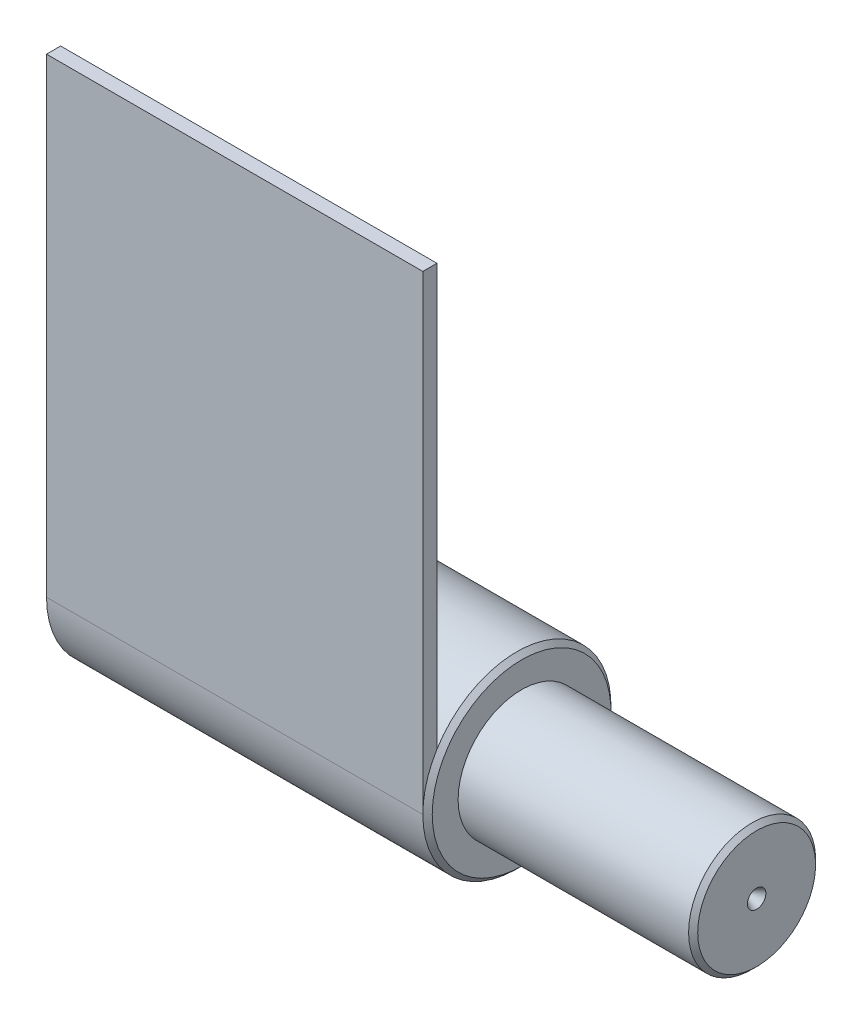
ISO-10303-21;
HEADER;
FILE_DESCRIPTION(('STEP AP214'),'2;1');
FILE_NAME('part.step','',(''),(''),'','','');
FILE_SCHEMA(('AUTOMOTIVE_DESIGN { 1 0 10303 214 1 1 1 1 }'));
ENDSEC;
DATA;
#1=APPLICATION_CONTEXT('core data for automotive mechanical design processes');
#2=APPLICATION_PROTOCOL_DEFINITION('international standard','automotive_design',2000,#1);
#3=PRODUCT_CONTEXT('',#1,'mechanical');
#4=PRODUCT('Part','Part','',(#3));
#5=PRODUCT_RELATED_PRODUCT_CATEGORY('part','',(#4));
#6=PRODUCT_DEFINITION_FORMATION('','',#4);
#7=PRODUCT_DEFINITION_CONTEXT('part definition',#1,'design');
#8=PRODUCT_DEFINITION('design','',#6,#7);
#9=PRODUCT_DEFINITION_SHAPE('','',#8);
#10=(LENGTH_UNIT() NAMED_UNIT(*) SI_UNIT(.MILLI.,.METRE.));
#11=(NAMED_UNIT(*) PLANE_ANGLE_UNIT() SI_UNIT($,.RADIAN.));
#12=(NAMED_UNIT(*) SI_UNIT($,.STERADIAN.) SOLID_ANGLE_UNIT());
#13=UNCERTAINTY_MEASURE_WITH_UNIT(LENGTH_MEASURE(1.E-05),#10,'distance_accuracy_value','');
#14=(GEOMETRIC_REPRESENTATION_CONTEXT(3) GLOBAL_UNCERTAINTY_ASSIGNED_CONTEXT((#13)) GLOBAL_UNIT_ASSIGNED_CONTEXT((#10,
#11,#12)) REPRESENTATION_CONTEXT('',''));
#15=CARTESIAN_POINT('',(0.,0.,0.));
#16=DIRECTION('',(0.,0.,1.));
#17=DIRECTION('',(1.,0.,0.));
#18=AXIS2_PLACEMENT_3D('',#15,#16,#17);
#19=CARTESIAN_POINT('',(-58.6080417490214,0.,-2.337527378994));
#20=DIRECTION('',(-1.,0.,0.));
#21=DIRECTION('',(0.,0.,1.));
#22=AXIS2_PLACEMENT_3D('',#19,#20,#21);
#23=CYLINDRICAL_SURFACE('',#22,20.);
#24=DIRECTION('',(-1.,0.,0.));
#25=VECTOR('',#24,1.);
#26=CARTESIAN_POINT('',(-58.6080417490214,10.5357384574783,14.6624201255018));
#27=LINE('',#26,#25);
#28=CARTESIAN_POINT('',(34.4725026973746,10.5357384574783,14.6624201255018));
#29=VERTEX_POINT('',#28);
#30=CARTESIAN_POINT('',(-45.5274973026254,10.5357384574783,14.6624201255018));
#31=VERTEX_POINT('',#30);
#32=EDGE_CURVE('E100',#29,#31,#27,.T.);
#33=ORIENTED_EDGE('',*,*,#32,.F.);
#34=CARTESIAN_POINT('',(34.4725026973746,0.,-2.337527378994));
#35=DIRECTION('',(-1.,0.,0.));
#36=DIRECTION('',(0.,0.,1.));
#37=AXIS2_PLACEMENT_3D('',#34,#35,#36);
#38=CIRCLE('',#37,20.);
#39=CARTESIAN_POINT('',(34.4725026973746,0.,17.662472621006));
#40=VERTEX_POINT('',#39);
#41=EDGE_CURVE('E123',#29,#40,#38,.T.);
#42=ORIENTED_EDGE('',*,*,#41,.T.);
#43=DIRECTION('',(1.,0.,0.));
#44=VECTOR('',#43,1.);
#45=CARTESIAN_POINT('',(-45.5274973026254,0.,17.662472621006));
#46=LINE('',#45,#44);
#47=CARTESIAN_POINT('',(-45.5274973026254,0.,17.662472621006));
#48=VERTEX_POINT('',#47);
#49=EDGE_CURVE('E55',#48,#40,#46,.T.);
#50=ORIENTED_EDGE('',*,*,#49,.F.);
#51=CARTESIAN_POINT('',(-45.5274973026254,0.,-2.337527378994));
#52=DIRECTION('',(-1.,0.,0.));
#53=DIRECTION('',(0.,0.,1.));
#54=AXIS2_PLACEMENT_3D('',#51,#52,#53);
#55=CIRCLE('',#54,20.);
#56=EDGE_CURVE('E50',#31,#48,#55,.T.);
#57=ORIENTED_EDGE('',*,*,#56,.F.);
#58=EDGE_LOOP('',(#33,#42,#50,#57));
#59=FACE_BOUND('',#58,.T.);
#60=ADVANCED_FACE('F35',(#59),#23,.T.);
#61=CARTESIAN_POINT('',(-47.5274973026254,0.,-20.337527378994));
#62=DIRECTION('',(1.,0.,0.));
#63=DIRECTION('',(0.,0.,-1.));
#64=AXIS2_PLACEMENT_3D('',#61,#62,#63);
#65=PLANE('',#64);
#66=CARTESIAN_POINT('',(-47.5274973026254,0.,-2.337527378994));
#67=DIRECTION('',(-1.,0.,0.));
#68=DIRECTION('',(0.,0.,1.));
#69=AXIS2_PLACEMENT_3D('',#66,#67,#68);
#70=CIRCLE('',#69,18.);
#71=CARTESIAN_POINT('',(-47.5274973026254,0.,15.662472621006));
#72=VERTEX_POINT('',#71);
#73=EDGE_CURVE('E11',#72,#72,#70,.T.);
#74=ORIENTED_EDGE('',*,*,#73,.T.);
#75=EDGE_LOOP('',(#74));
#76=FACE_BOUND('',#75,.T.);
#77=ADVANCED_FACE('F37',(#76),#65,.F.);
#78=CARTESIAN_POINT('',(-45.5274973026254,0.,-2.337527378994));
#79=DIRECTION('',(1.,0.,0.));
#80=DIRECTION('',(0.,0.,-1.));
#81=AXIS2_PLACEMENT_3D('',#78,#79,#80);
#82=CONICAL_SURFACE('',#81,20.,0.78539816339745);
#83=ORIENTED_EDGE('',*,*,#73,.F.);
#84=EDGE_LOOP('',(#83));
#85=FACE_BOUND('',#84,.T.);
#86=EDGE_CURVE('E43',#48,#31,#55,.T.);
#87=ORIENTED_EDGE('',*,*,#86,.T.);
#88=ORIENTED_EDGE('',*,*,#56,.T.);
#89=EDGE_LOOP('',(#87,#88));
#90=FACE_BOUND('',#89,.T.);
#91=ADVANCED_FACE('F127',(#85,#90),#82,.T.);
#92=CARTESIAN_POINT('',(35.4725026973746,0.,-2.337527378994));
#93=DIRECTION('',(-1.,0.,0.));
#94=DIRECTION('',(0.,0.,1.));
#95=AXIS2_PLACEMENT_3D('',#92,#93,#94);
#96=CONICAL_SURFACE('',#95,19.,0.785398163397448);
#97=EDGE_CURVE('E124',#40,#29,#38,.T.);
#98=ORIENTED_EDGE('',*,*,#97,.F.);
#99=ORIENTED_EDGE('',*,*,#41,.F.);
#100=EDGE_LOOP('',(#98,#99));
#101=FACE_BOUND('',#100,.T.);
#102=CARTESIAN_POINT('',(35.4725026973746,0.,-2.337527378994));
#103=DIRECTION('',(-1.,0.,0.));
#104=DIRECTION('',(0.,0.,1.));
#105=AXIS2_PLACEMENT_3D('',#102,#103,#104);
#106=CIRCLE('',#105,19.);
#107=CARTESIAN_POINT('',(35.4725026973746,0.,16.662472621006));
#108=VERTEX_POINT('',#107);
#109=EDGE_CURVE('E120',#108,#108,#106,.T.);
#110=ORIENTED_EDGE('',*,*,#109,.T.);
#111=EDGE_LOOP('',(#110));
#112=FACE_BOUND('',#111,.T.);
#113=ADVANCED_FACE('F129',(#101,#112),#96,.T.);
#114=CARTESIAN_POINT('',(35.4725026973746,0.,-21.337527378994));
#115=DIRECTION('',(-1.,0.,0.));
#116=DIRECTION('',(0.,0.,1.));
#117=AXIS2_PLACEMENT_3D('',#114,#115,#116);
#118=PLANE('',#117);
#119=ORIENTED_EDGE('',*,*,#109,.F.);
#120=EDGE_LOOP('',(#119));
#121=FACE_BOUND('',#120,.T.);
#122=CARTESIAN_POINT('',(35.4725026973746,0.,-2.337527378994));
#123=DIRECTION('',(-1.,0.,0.));
#124=DIRECTION('',(0.,0.,1.));
#125=AXIS2_PLACEMENT_3D('',#122,#123,#124);
#126=CIRCLE('',#125,13.5);
#127=CARTESIAN_POINT('',(35.4725026973746,0.,11.162472621006));
#128=VERTEX_POINT('',#127);
#129=EDGE_CURVE('E117',#128,#128,#126,.T.);
#130=ORIENTED_EDGE('',*,*,#129,.T.);
#131=EDGE_LOOP('',(#130));
#132=FACE_BOUND('',#131,.T.);
#133=ADVANCED_FACE('F135',(#121,#132),#118,.F.);
#134=CARTESIAN_POINT('',(-58.6080417490214,0.,-2.337527378994));
#135=DIRECTION('',(-1.,0.,0.));
#136=DIRECTION('',(0.,0.,1.));
#137=AXIS2_PLACEMENT_3D('',#134,#135,#136);
#138=CYLINDRICAL_SURFACE('',#137,13.5);
#139=ORIENTED_EDGE('',*,*,#129,.F.);
#140=EDGE_LOOP('',(#139));
#141=FACE_BOUND('',#140,.T.);
#142=CARTESIAN_POINT('',(84.4725026973746,0.,-2.337527378994));
#143=DIRECTION('',(-1.,0.,0.));
#144=DIRECTION('',(0.,0.,1.));
#145=AXIS2_PLACEMENT_3D('',#142,#143,#144);
#146=CIRCLE('',#145,13.5);
#147=CARTESIAN_POINT('',(84.4725026973746,0.,11.162472621006));
#148=VERTEX_POINT('',#147);
#149=EDGE_CURVE('E114',#148,#148,#146,.T.);
#150=ORIENTED_EDGE('',*,*,#149,.T.);
#151=EDGE_LOOP('',(#150));
#152=FACE_BOUND('',#151,.T.);
#153=ADVANCED_FACE('F148',(#141,#152),#138,.T.);
#154=CARTESIAN_POINT('',(85.4415583764698,0.,-2.337527378994));
#155=DIRECTION('',(-1.,0.,0.));
#156=DIRECTION('',(0.,0.,1.));
#157=AXIS2_PLACEMENT_3D('',#154,#155,#156);
#158=CONICAL_SURFACE('',#157,12.5309443209048,0.785398163397463);
#159=ORIENTED_EDGE('',*,*,#149,.F.);
#160=EDGE_LOOP('',(#159));
#161=FACE_BOUND('',#160,.T.);
#162=CARTESIAN_POINT('',(85.4415583764698,0.,-2.337527378994));
#163=DIRECTION('',(-1.,0.,0.));
#164=DIRECTION('',(0.,0.,1.));
#165=AXIS2_PLACEMENT_3D('',#162,#163,#164);
#166=CIRCLE('',#165,12.5309443209048);
#167=CARTESIAN_POINT('',(85.4415583764698,0.,10.1934169419108));
#168=VERTEX_POINT('',#167);
#169=EDGE_CURVE('E111',#168,#168,#166,.T.);
#170=ORIENTED_EDGE('',*,*,#169,.T.);
#171=EDGE_LOOP('',(#170));
#172=FACE_BOUND('',#171,.T.);
#173=ADVANCED_FACE('F152',(#161,#172),#158,.T.);
#174=CARTESIAN_POINT('',(85.4415583764698,0.,-14.8684716998988));
#175=DIRECTION('',(-1.,0.,0.));
#176=DIRECTION('',(0.,0.,1.));
#177=AXIS2_PLACEMENT_3D('',#174,#175,#176);
#178=PLANE('',#177);
#179=ORIENTED_EDGE('',*,*,#169,.F.);
#180=EDGE_LOOP('',(#179));
#181=FACE_BOUND('',#180,.T.);
#182=CARTESIAN_POINT('',(85.4415583764698,0.,-2.337527378994));
#183=DIRECTION('',(-1.,0.,0.));
#184=DIRECTION('',(0.,0.,1.));
#185=AXIS2_PLACEMENT_3D('',#182,#183,#184);
#186=CIRCLE('',#185,1.95889593673989);
#187=CARTESIAN_POINT('',(85.4415583764698,0.,-0.378631442254107));
#188=VERTEX_POINT('',#187);
#189=EDGE_CURVE('E103',#188,#188,#186,.T.);
#190=ORIENTED_EDGE('',*,*,#189,.T.);
#191=EDGE_LOOP('',(#190));
#192=FACE_BOUND('',#191,.T.);
#193=ADVANCED_FACE('F156',(#181,#192),#178,.F.);
#194=CARTESIAN_POINT('',(82.259183131536,0.,-2.337527378994));
#195=DIRECTION('',(1.,0.,0.));
#196=DIRECTION('',(0.,0.,-1.));
#197=AXIS2_PLACEMENT_3D('',#194,#195,#196);
#198=CONICAL_SURFACE('',#197,0.,0.551771479369417);
#199=ORIENTED_EDGE('',*,*,#189,.F.);
#200=EDGE_LOOP('',(#199));
#201=FACE_BOUND('',#200,.T.);
#202=CARTESIAN_POINT('',(82.259183131536,0.,-2.337527378994));
#203=VERTEX_POINT('',#202);
#204=VERTEX_LOOP('',#203);
#205=FACE_BOUND('',#204,.T.);
#206=ADVANCED_FACE('F160',(#201,#205),#198,.F.);
#207=CARTESIAN_POINT('',(-45.5274973026254,100.,17.662472621006));
#208=DIRECTION('',(1.,0.,0.));
#209=DIRECTION('',(0.,0.,-1.));
#210=AXIS2_PLACEMENT_3D('',#207,#208,#209);
#211=PLANE('',#210);
#212=DIRECTION('',(0.,-1.,0.));
#213=VECTOR('',#212,1.);
#214=CARTESIAN_POINT('',(-45.5274973026254,100.,14.6624201255018));
#215=LINE('',#214,#213);
#216=CARTESIAN_POINT('',(-45.5274973026254,100.,14.6624201255018));
#217=VERTEX_POINT('',#216);
#218=EDGE_CURVE('E259',#217,#31,#215,.T.);
#219=ORIENTED_EDGE('',*,*,#218,.T.);
#220=ORIENTED_EDGE('',*,*,#86,.F.);
#221=DIRECTION('',(0.,-1.,0.));
#222=VECTOR('',#221,1.);
#223=CARTESIAN_POINT('',(-45.5274973026254,100.,17.662472621006));
#224=LINE('',#223,#222);
#225=CARTESIAN_POINT('',(-45.5274973026254,100.,17.662472621006));
#226=VERTEX_POINT('',#225);
#227=EDGE_CURVE('E82',#226,#48,#224,.T.);
#228=ORIENTED_EDGE('',*,*,#227,.F.);
#229=DIRECTION('',(0.,0.,1.));
#230=VECTOR('',#229,1.);
#231=CARTESIAN_POINT('',(-45.5274973026254,100.,17.662472621006));
#232=LINE('',#231,#230);
#233=EDGE_CURVE('E88',#217,#226,#232,.T.);
#234=ORIENTED_EDGE('',*,*,#233,.F.);
#235=EDGE_LOOP('',(#219,#220,#228,#234));
#236=FACE_BOUND('',#235,.T.);
#237=ADVANCED_FACE('F99',(#236),#211,.F.);
#238=CARTESIAN_POINT('',(34.4725026973746,100.,17.662472621006));
#239=DIRECTION('',(-1.,0.,0.));
#240=DIRECTION('',(0.,0.,1.));
#241=AXIS2_PLACEMENT_3D('',#238,#239,#240);
#242=PLANE('',#241);
#243=DIRECTION('',(0.,-1.,0.));
#244=VECTOR('',#243,1.);
#245=CARTESIAN_POINT('',(34.4725026973746,100.,17.662472621006));
#246=LINE('',#245,#244);
#247=CARTESIAN_POINT('',(34.4725026973746,100.,17.662472621006));
#248=VERTEX_POINT('',#247);
#249=EDGE_CURVE('E84',#248,#40,#246,.T.);
#250=ORIENTED_EDGE('',*,*,#249,.T.);
#251=ORIENTED_EDGE('',*,*,#97,.T.);
#252=DIRECTION('',(0.,-1.,0.));
#253=VECTOR('',#252,1.);
#254=CARTESIAN_POINT('',(34.4725026973746,100.,14.6624201255018));
#255=LINE('',#254,#253);
#256=CARTESIAN_POINT('',(34.4725026973746,100.,14.6624201255018));
#257=VERTEX_POINT('',#256);
#258=EDGE_CURVE('E105',#257,#29,#255,.T.);
#259=ORIENTED_EDGE('',*,*,#258,.F.);
#260=DIRECTION('',(0.,0.,-1.));
#261=VECTOR('',#260,1.);
#262=CARTESIAN_POINT('',(34.4725026973746,100.,17.662472621006));
#263=LINE('',#262,#261);
#264=EDGE_CURVE('E87',#248,#257,#263,.T.);
#265=ORIENTED_EDGE('',*,*,#264,.F.);
#266=EDGE_LOOP('',(#250,#251,#259,#265));
#267=FACE_BOUND('',#266,.T.);
#268=ADVANCED_FACE('F167',(#267),#242,.F.);
#269=CARTESIAN_POINT('',(-45.5274973026254,100.,14.6624201255018));
#270=DIRECTION('',(0.,0.,1.));
#271=DIRECTION('',(1.,0.,0.));
#272=AXIS2_PLACEMENT_3D('',#269,#270,#271);
#273=PLANE('',#272);
#274=ORIENTED_EDGE('',*,*,#258,.T.);
#275=ORIENTED_EDGE('',*,*,#32,.T.);
#276=ORIENTED_EDGE('',*,*,#218,.F.);
#277=DIRECTION('',(-1.,0.,0.));
#278=VECTOR('',#277,1.);
#279=CARTESIAN_POINT('',(-45.5274973026254,100.,14.6624201255018));
#280=LINE('',#279,#278);
#281=EDGE_CURVE('E93',#257,#217,#280,.T.);
#282=ORIENTED_EDGE('',*,*,#281,.F.);
#283=EDGE_LOOP('',(#274,#275,#276,#282));
#284=FACE_BOUND('',#283,.T.);
#285=ADVANCED_FACE('F170',(#284),#273,.F.);
#286=CARTESIAN_POINT('',(-45.5274973026254,100.,17.662472621006));
#287=DIRECTION('',(0.,0.,-1.));
#288=DIRECTION('',(-1.,0.,0.));
#289=AXIS2_PLACEMENT_3D('',#286,#287,#288);
#290=PLANE('',#289);
#291=ORIENTED_EDGE('',*,*,#49,.T.);
#292=ORIENTED_EDGE('',*,*,#249,.F.);
#293=DIRECTION('',(1.,0.,0.));
#294=VECTOR('',#293,1.);
#295=CARTESIAN_POINT('',(-45.5274973026254,100.,17.662472621006));
#296=LINE('',#295,#294);
#297=EDGE_CURVE('E78',#226,#248,#296,.T.);
#298=ORIENTED_EDGE('',*,*,#297,.F.);
#299=ORIENTED_EDGE('',*,*,#227,.T.);
#300=EDGE_LOOP('',(#291,#292,#298,#299));
#301=FACE_BOUND('',#300,.T.);
#302=ADVANCED_FACE('F80',(#301),#290,.F.);
#303=CARTESIAN_POINT('',(0.,100.,0.));
#304=DIRECTION('',(0.,-1.,0.));
#305=DIRECTION('',(0.,0.,-1.));
#306=AXIS2_PLACEMENT_3D('',#303,#304,#305);
#307=PLANE('',#306);
#308=ORIENTED_EDGE('',*,*,#233,.T.);
#309=ORIENTED_EDGE('',*,*,#297,.T.);
#310=ORIENTED_EDGE('',*,*,#264,.T.);
#311=ORIENTED_EDGE('',*,*,#281,.T.);
#312=EDGE_LOOP('',(#308,#309,#310,#311));
#313=FACE_BOUND('',#312,.T.);
#314=ADVANCED_FACE('F91',(#313),#307,.F.);
#315=CLOSED_SHELL('',(#60,#77,#91,#113,#133,#153,#173,#193,#206,#237,#268,#285,#302,#314));
#316=MANIFOLD_SOLID_BREP('B2',#315);
#317=ADVANCED_BREP_SHAPE_REPRESENTATION('',(#18,#316),#14);
#318=SHAPE_DEFINITION_REPRESENTATION(#9,#317);
ENDSEC;
END-ISO-10303-21;
